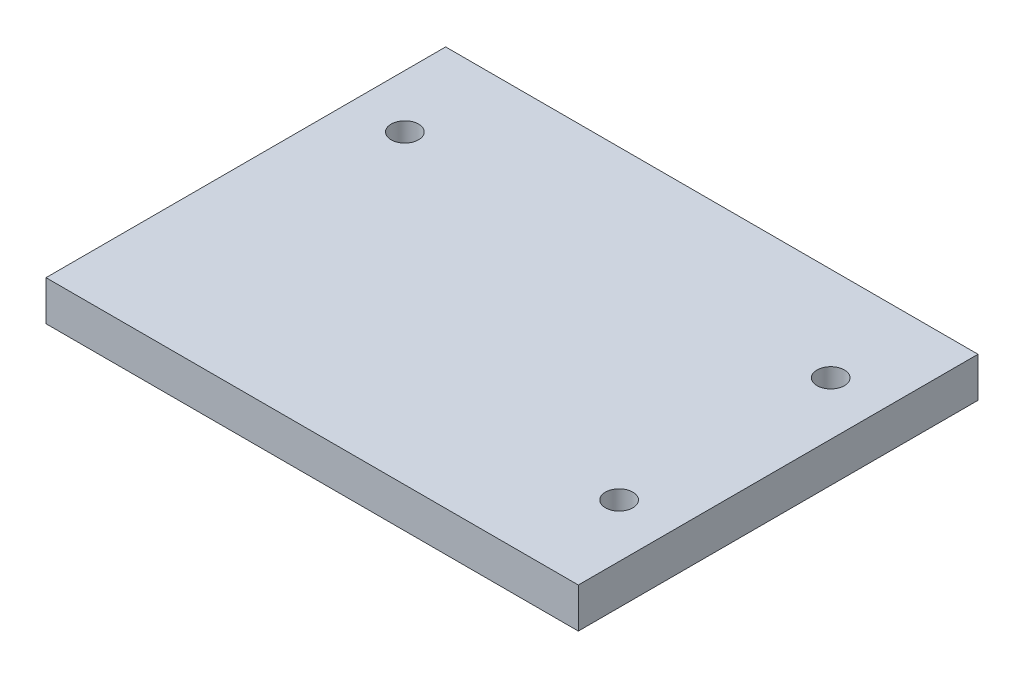
ISO-10303-21;
HEADER;
FILE_DESCRIPTION(('STEP AP214'),'2;1');
FILE_NAME('part.step','',(''),(''),'','','');
FILE_SCHEMA(('AUTOMOTIVE_DESIGN { 1 0 10303 214 1 1 1 1 }'));
ENDSEC;
DATA;
#1=APPLICATION_CONTEXT('core data for automotive mechanical design processes');
#2=APPLICATION_PROTOCOL_DEFINITION('international standard','automotive_design',2000,#1);
#3=PRODUCT_CONTEXT('',#1,'mechanical');
#4=PRODUCT('Part','Part','',(#3));
#5=PRODUCT_RELATED_PRODUCT_CATEGORY('part','',(#4));
#6=PRODUCT_DEFINITION_FORMATION('','',#4);
#7=PRODUCT_DEFINITION_CONTEXT('part definition',#1,'design');
#8=PRODUCT_DEFINITION('design','',#6,#7);
#9=PRODUCT_DEFINITION_SHAPE('','',#8);
#10=(LENGTH_UNIT() NAMED_UNIT(*) SI_UNIT(.MILLI.,.METRE.));
#11=(NAMED_UNIT(*) PLANE_ANGLE_UNIT() SI_UNIT($,.RADIAN.));
#12=(NAMED_UNIT(*) SI_UNIT($,.STERADIAN.) SOLID_ANGLE_UNIT());
#13=UNCERTAINTY_MEASURE_WITH_UNIT(LENGTH_MEASURE(1.E-05),#10,'distance_accuracy_value','');
#14=(GEOMETRIC_REPRESENTATION_CONTEXT(3) GLOBAL_UNCERTAINTY_ASSIGNED_CONTEXT((#13)) GLOBAL_UNIT_ASSIGNED_CONTEXT((#10,
#11,#12)) REPRESENTATION_CONTEXT('',''));
#15=CARTESIAN_POINT('',(0.,0.,0.));
#16=DIRECTION('',(0.,0.,1.));
#17=DIRECTION('',(1.,0.,0.));
#18=AXIS2_PLACEMENT_3D('',#15,#16,#17);
#19=CARTESIAN_POINT('',(0.,9.525,0.));
#20=DIRECTION('',(0.,1.,0.));
#21=DIRECTION('',(0.,0.,1.));
#22=AXIS2_PLACEMENT_3D('',#19,#20,#21);
#23=PLANE('',#22);
#24=CARTESIAN_POINT('',(50.8000037122111,9.525,-80.4872070292015));
#25=DIRECTION('',(0.,1.,0.));
#26=DIRECTION('',(0.,0.,1.));
#27=AXIS2_PLACEMENT_3D('',#24,#25,#26);
#28=CIRCLE('',#27,3.26390000000001);
#29=CARTESIAN_POINT('',(50.8000037122111,9.525,-83.7511070292015));
#30=VERTEX_POINT('',#29);
#31=EDGE_CURVE('E121',#30,#30,#28,.T.);
#32=ORIENTED_EDGE('',*,*,#31,.F.);
#33=EDGE_LOOP('',(#32));
#34=FACE_BOUND('',#33,.T.);
#35=DIRECTION('',(0.,0.,-1.));
#36=VECTOR('',#35,1.);
#37=CARTESIAN_POINT('',(63.5000015058791,9.525,-102.924639145253));
#38=LINE('',#37,#36);
#39=CARTESIAN_POINT('',(63.5000015058791,9.525,-7.57478379530386));
#40=VERTEX_POINT('',#39);
#41=CARTESIAN_POINT('',(63.5000015058791,9.525,-102.924639145253));
#42=VERTEX_POINT('',#41);
#43=EDGE_CURVE('E91',#40,#42,#38,.T.);
#44=ORIENTED_EDGE('',*,*,#43,.T.);
#45=DIRECTION('',(-1.,0.,0.));
#46=VECTOR('',#45,1.);
#47=CARTESIAN_POINT('',(-63.4999984941209,9.525,-102.924639145253));
#48=LINE('',#47,#46);
#49=CARTESIAN_POINT('',(-63.4999984941209,9.525,-102.924639145253));
#50=VERTEX_POINT('',#49);
#51=EDGE_CURVE('E86',#42,#50,#48,.T.);
#52=ORIENTED_EDGE('',*,*,#51,.T.);
#53=DIRECTION('',(0.,0.,1.));
#54=VECTOR('',#53,1.);
#55=CARTESIAN_POINT('',(-63.4999984941209,9.525,-102.924639145253));
#56=LINE('',#55,#54);
#57=CARTESIAN_POINT('',(-63.4999984941209,9.525,-7.57478379530388));
#58=VERTEX_POINT('',#57);
#59=EDGE_CURVE('E89',#50,#58,#56,.T.);
#60=ORIENTED_EDGE('',*,*,#59,.T.);
#61=DIRECTION('',(1.,0.,0.));
#62=VECTOR('',#61,1.);
#63=CARTESIAN_POINT('',(-63.4999984941209,9.525,-7.57478379530388));
#64=LINE('',#63,#62);
#65=EDGE_CURVE('E56',#58,#40,#64,.T.);
#66=ORIENTED_EDGE('',*,*,#65,.T.);
#67=EDGE_LOOP('',(#44,#52,#60,#66));
#68=FACE_BOUND('',#67,.T.);
#69=CARTESIAN_POINT('',(-50.8000007004529,9.525,-80.4872070292015));
#70=DIRECTION('',(0.,1.,0.));
#71=DIRECTION('',(0.,0.,1.));
#72=AXIS2_PLACEMENT_3D('',#69,#70,#71);
#73=CIRCLE('',#72,3.2639);
#74=CARTESIAN_POINT('',(-50.8000007004529,9.525,-83.7511070292015));
#75=VERTEX_POINT('',#74);
#76=EDGE_CURVE('E106',#75,#75,#73,.T.);
#77=ORIENTED_EDGE('',*,*,#76,.F.);
#78=EDGE_LOOP('',(#77));
#79=FACE_BOUND('',#78,.T.);
#80=CARTESIAN_POINT('',(50.8000037122111,9.525,-30.0122159113554));
#81=DIRECTION('',(0.,1.,0.));
#82=DIRECTION('',(0.,0.,1.));
#83=AXIS2_PLACEMENT_3D('',#80,#81,#82);
#84=CIRCLE('',#83,3.26390000000001);
#85=CARTESIAN_POINT('',(50.8000037122111,9.525,-33.2761159113554));
#86=VERTEX_POINT('',#85);
#87=EDGE_CURVE('E127',#86,#86,#84,.T.);
#88=ORIENTED_EDGE('',*,*,#87,.F.);
#89=EDGE_LOOP('',(#88));
#90=FACE_BOUND('',#89,.T.);
#91=ADVANCED_FACE('F39',(#34,#68,#79,#90),#23,.T.);
#92=CARTESIAN_POINT('',(0.,0.,0.));
#93=DIRECTION('',(0.,1.,0.));
#94=DIRECTION('',(0.,0.,1.));
#95=AXIS2_PLACEMENT_3D('',#92,#93,#94);
#96=PLANE('',#95);
#97=DIRECTION('',(0.,0.,-1.));
#98=VECTOR('',#97,1.);
#99=CARTESIAN_POINT('',(63.5000015058791,0.,-102.924639145253));
#100=LINE('',#99,#98);
#101=CARTESIAN_POINT('',(63.5000015058791,0.,-7.57478379530386));
#102=VERTEX_POINT('',#101);
#103=CARTESIAN_POINT('',(63.5000015058791,0.,-102.924639145253));
#104=VERTEX_POINT('',#103);
#105=EDGE_CURVE('E103',#102,#104,#100,.T.);
#106=ORIENTED_EDGE('',*,*,#105,.F.);
#107=DIRECTION('',(1.,0.,0.));
#108=VECTOR('',#107,1.);
#109=CARTESIAN_POINT('',(-63.4999984941209,0.,-7.57478379530388));
#110=LINE('',#109,#108);
#111=CARTESIAN_POINT('',(-63.4999984941209,0.,-7.57478379530388));
#112=VERTEX_POINT('',#111);
#113=EDGE_CURVE('E79',#112,#102,#110,.T.);
#114=ORIENTED_EDGE('',*,*,#113,.F.);
#115=DIRECTION('',(0.,0.,1.));
#116=VECTOR('',#115,1.);
#117=CARTESIAN_POINT('',(-63.4999984941209,0.,-102.924639145253));
#118=LINE('',#117,#116);
#119=CARTESIAN_POINT('',(-63.4999984941209,0.,-102.924639145253));
#120=VERTEX_POINT('',#119);
#121=EDGE_CURVE('E73',#120,#112,#118,.T.);
#122=ORIENTED_EDGE('',*,*,#121,.F.);
#123=DIRECTION('',(-1.,0.,0.));
#124=VECTOR('',#123,1.);
#125=CARTESIAN_POINT('',(-63.4999984941209,0.,-102.924639145253));
#126=LINE('',#125,#124);
#127=EDGE_CURVE('E95',#104,#120,#126,.T.);
#128=ORIENTED_EDGE('',*,*,#127,.F.);
#129=EDGE_LOOP('',(#106,#114,#122,#128));
#130=FACE_BOUND('',#129,.T.);
#131=CARTESIAN_POINT('',(-50.8000007004529,0.,-80.4872070292015));
#132=DIRECTION('',(0.,1.,0.));
#133=DIRECTION('',(0.,0.,1.));
#134=AXIS2_PLACEMENT_3D('',#131,#132,#133);
#135=CIRCLE('',#134,3.2639);
#136=CARTESIAN_POINT('',(-50.8000007004529,0.,-83.7511070292015));
#137=VERTEX_POINT('',#136);
#138=EDGE_CURVE('E118',#137,#137,#135,.T.);
#139=ORIENTED_EDGE('',*,*,#138,.T.);
#140=EDGE_LOOP('',(#139));
#141=FACE_BOUND('',#140,.T.);
#142=CARTESIAN_POINT('',(50.8000037122111,0.,-80.4872070292015));
#143=DIRECTION('',(0.,1.,0.));
#144=DIRECTION('',(0.,0.,1.));
#145=AXIS2_PLACEMENT_3D('',#142,#143,#144);
#146=CIRCLE('',#145,3.26390000000001);
#147=CARTESIAN_POINT('',(50.8000037122111,0.,-83.7511070292015));
#148=VERTEX_POINT('',#147);
#149=EDGE_CURVE('E124',#148,#148,#146,.T.);
#150=ORIENTED_EDGE('',*,*,#149,.T.);
#151=EDGE_LOOP('',(#150));
#152=FACE_BOUND('',#151,.T.);
#153=CARTESIAN_POINT('',(50.8000037122111,0.,-30.0122159113554));
#154=DIRECTION('',(0.,1.,0.));
#155=DIRECTION('',(0.,0.,1.));
#156=AXIS2_PLACEMENT_3D('',#153,#154,#155);
#157=CIRCLE('',#156,3.26390000000001);
#158=CARTESIAN_POINT('',(50.8000037122111,0.,-33.2761159113554));
#159=VERTEX_POINT('',#158);
#160=EDGE_CURVE('E130',#159,#159,#157,.T.);
#161=ORIENTED_EDGE('',*,*,#160,.T.);
#162=EDGE_LOOP('',(#161));
#163=FACE_BOUND('',#162,.T.);
#164=ADVANCED_FACE('F114',(#130,#141,#152,#163),#96,.F.);
#165=CARTESIAN_POINT('',(63.5000015058791,9.525,-102.924639145253));
#166=DIRECTION('',(-1.,0.,0.));
#167=DIRECTION('',(0.,0.,1.));
#168=AXIS2_PLACEMENT_3D('',#165,#166,#167);
#169=PLANE('',#168);
#170=ORIENTED_EDGE('',*,*,#105,.T.);
#171=DIRECTION('',(0.,-1.,0.));
#172=VECTOR('',#171,1.);
#173=CARTESIAN_POINT('',(63.5000015058791,9.525,-102.924639145253));
#174=LINE('',#173,#172);
#175=EDGE_CURVE('E11',#42,#104,#174,.T.);
#176=ORIENTED_EDGE('',*,*,#175,.F.);
#177=ORIENTED_EDGE('',*,*,#43,.F.);
#178=DIRECTION('',(0.,-1.,0.));
#179=VECTOR('',#178,1.);
#180=CARTESIAN_POINT('',(63.5000015058791,9.525,-7.57478379530386));
#181=LINE('',#180,#179);
#182=EDGE_CURVE('E99',#40,#102,#181,.T.);
#183=ORIENTED_EDGE('',*,*,#182,.T.);
#184=EDGE_LOOP('',(#170,#176,#177,#183));
#185=FACE_BOUND('',#184,.T.);
#186=ADVANCED_FACE('F41',(#185),#169,.F.);
#187=CARTESIAN_POINT('',(-63.4999984941209,9.525,-102.924639145253));
#188=DIRECTION('',(0.,0.,1.));
#189=DIRECTION('',(1.,0.,0.));
#190=AXIS2_PLACEMENT_3D('',#187,#188,#189);
#191=PLANE('',#190);
#192=ORIENTED_EDGE('',*,*,#127,.T.);
#193=DIRECTION('',(0.,-1.,0.));
#194=VECTOR('',#193,1.);
#195=CARTESIAN_POINT('',(-63.4999984941209,9.525,-102.924639145253));
#196=LINE('',#195,#194);
#197=EDGE_CURVE('E48',#50,#120,#196,.T.);
#198=ORIENTED_EDGE('',*,*,#197,.F.);
#199=ORIENTED_EDGE('',*,*,#51,.F.);
#200=ORIENTED_EDGE('',*,*,#175,.T.);
#201=EDGE_LOOP('',(#192,#198,#199,#200));
#202=FACE_BOUND('',#201,.T.);
#203=ADVANCED_FACE('F94',(#202),#191,.F.);
#204=CARTESIAN_POINT('',(-63.4999984941209,9.525,-102.924639145253));
#205=DIRECTION('',(1.,0.,0.));
#206=DIRECTION('',(0.,0.,-1.));
#207=AXIS2_PLACEMENT_3D('',#204,#205,#206);
#208=PLANE('',#207);
#209=ORIENTED_EDGE('',*,*,#121,.T.);
#210=DIRECTION('',(0.,-1.,0.));
#211=VECTOR('',#210,1.);
#212=CARTESIAN_POINT('',(-63.4999984941209,9.525,-7.57478379530388));
#213=LINE('',#212,#211);
#214=EDGE_CURVE('E96',#58,#112,#213,.T.);
#215=ORIENTED_EDGE('',*,*,#214,.F.);
#216=ORIENTED_EDGE('',*,*,#59,.F.);
#217=ORIENTED_EDGE('',*,*,#197,.T.);
#218=EDGE_LOOP('',(#209,#215,#216,#217));
#219=FACE_BOUND('',#218,.T.);
#220=ADVANCED_FACE('F97',(#219),#208,.F.);
#221=CARTESIAN_POINT('',(-63.4999984941209,9.525,-7.57478379530388));
#222=DIRECTION('',(0.,0.,-1.));
#223=DIRECTION('',(-1.,0.,0.));
#224=AXIS2_PLACEMENT_3D('',#221,#222,#223);
#225=PLANE('',#224);
#226=ORIENTED_EDGE('',*,*,#113,.T.);
#227=ORIENTED_EDGE('',*,*,#182,.F.);
#228=ORIENTED_EDGE('',*,*,#65,.F.);
#229=ORIENTED_EDGE('',*,*,#214,.T.);
#230=EDGE_LOOP('',(#226,#227,#228,#229));
#231=FACE_BOUND('',#230,.T.);
#232=ADVANCED_FACE('F111',(#231),#225,.F.);
#233=CARTESIAN_POINT('',(-50.8000007004529,9.525,-80.4872070292015));
#234=DIRECTION('',(0.,-1.,0.));
#235=DIRECTION('',(0.,0.,-1.));
#236=AXIS2_PLACEMENT_3D('',#233,#234,#235);
#237=CYLINDRICAL_SURFACE('',#236,3.2639);
#238=CARTESIAN_POINT('',(-50.8000007004529,9.525,-83.7511070292015));
#239=CARTESIAN_POINT('',(-50.8000007004529,9.42578125,-83.7511070292015));
#240=CARTESIAN_POINT('',(-50.8000007004529,9.3265625,-83.7511070292015));
#241=CARTESIAN_POINT('',(-50.8000007004529,9.128125,-83.7511070292015));
#242=CARTESIAN_POINT('',(-50.8000007004529,9.02890625,-83.7511070292015));
#243=CARTESIAN_POINT('',(-50.8000007004529,8.83046875,-83.7511070292015));
#244=CARTESIAN_POINT('',(-50.8000007004529,8.73125,-83.7511070292015));
#245=CARTESIAN_POINT('',(-50.8000007004529,8.5328125,-83.7511070292015));
#246=CARTESIAN_POINT('',(-50.8000007004529,8.43359375,-83.7511070292015));
#247=CARTESIAN_POINT('',(-50.8000007004529,8.23515625,-83.7511070292015));
#248=CARTESIAN_POINT('',(-50.8000007004529,8.1359375,-83.7511070292015));
#249=CARTESIAN_POINT('',(-50.8000007004529,7.9375,-83.7511070292015));
#250=CARTESIAN_POINT('',(-50.8000007004529,7.83828125,-83.7511070292015));
#251=CARTESIAN_POINT('',(-50.8000007004529,7.63984375,-83.7511070292015));
#252=CARTESIAN_POINT('',(-50.8000007004529,7.540625,-83.7511070292015));
#253=CARTESIAN_POINT('',(-50.8000007004529,7.3421875,-83.7511070292015));
#254=CARTESIAN_POINT('',(-50.8000007004529,7.24296875,-83.7511070292015));
#255=CARTESIAN_POINT('',(-50.8000007004529,7.04453125,-83.7511070292015));
#256=CARTESIAN_POINT('',(-50.8000007004529,6.9453125,-83.7511070292015));
#257=CARTESIAN_POINT('',(-50.8000007004529,6.746875,-83.7511070292015));
#258=CARTESIAN_POINT('',(-50.8000007004529,6.64765625,-83.7511070292015));
#259=CARTESIAN_POINT('',(-50.8000007004529,6.44921875,-83.7511070292015));
#260=CARTESIAN_POINT('',(-50.8000007004529,6.35,-83.7511070292015));
#261=CARTESIAN_POINT('',(-50.8000007004529,6.1515625,-83.7511070292015));
#262=CARTESIAN_POINT('',(-50.8000007004529,6.05234375,-83.7511070292015));
#263=CARTESIAN_POINT('',(-50.8000007004529,5.85390625,-83.7511070292015));
#264=CARTESIAN_POINT('',(-50.8000007004529,5.7546875,-83.7511070292015));
#265=CARTESIAN_POINT('',(-50.8000007004529,5.55625,-83.7511070292015));
#266=CARTESIAN_POINT('',(-50.8000007004529,5.45703125,-83.7511070292015));
#267=CARTESIAN_POINT('',(-50.8000007004529,5.25859375,-83.7511070292015));
#268=CARTESIAN_POINT('',(-50.8000007004529,5.159375,-83.7511070292015));
#269=CARTESIAN_POINT('',(-50.8000007004529,4.9609375,-83.7511070292015));
#270=CARTESIAN_POINT('',(-50.8000007004529,4.86171875,-83.7511070292015));
#271=CARTESIAN_POINT('',(-50.8000007004529,4.66328125,-83.7511070292015));
#272=CARTESIAN_POINT('',(-50.8000007004529,4.5640625,-83.7511070292015));
#273=CARTESIAN_POINT('',(-50.8000007004529,4.365625,-83.7511070292015));
#274=CARTESIAN_POINT('',(-50.8000007004529,4.26640625,-83.7511070292015));
#275=CARTESIAN_POINT('',(-50.8000007004529,4.06796875,-83.7511070292015));
#276=CARTESIAN_POINT('',(-50.8000007004529,3.96875,-83.7511070292015));
#277=CARTESIAN_POINT('',(-50.8000007004529,3.7703125,-83.7511070292015));
#278=CARTESIAN_POINT('',(-50.8000007004529,3.67109375,-83.7511070292015));
#279=CARTESIAN_POINT('',(-50.8000007004529,3.47265625,-83.7511070292015));
#280=CARTESIAN_POINT('',(-50.8000007004529,3.3734375,-83.7511070292015));
#281=CARTESIAN_POINT('',(-50.8000007004529,3.175,-83.7511070292015));
#282=CARTESIAN_POINT('',(-50.8000007004529,3.07578125,-83.7511070292015));
#283=CARTESIAN_POINT('',(-50.8000007004529,2.87734375,-83.7511070292015));
#284=CARTESIAN_POINT('',(-50.8000007004529,2.778125,-83.7511070292015));
#285=CARTESIAN_POINT('',(-50.8000007004529,2.5796875,-83.7511070292015));
#286=CARTESIAN_POINT('',(-50.8000007004529,2.48046875,-83.7511070292015));
#287=CARTESIAN_POINT('',(-50.8000007004529,2.28203125,-83.7511070292015));
#288=CARTESIAN_POINT('',(-50.8000007004529,2.1828125,-83.7511070292015));
#289=CARTESIAN_POINT('',(-50.8000007004529,1.984375,-83.7511070292015));
#290=CARTESIAN_POINT('',(-50.8000007004529,1.88515625,-83.7511070292015));
#291=CARTESIAN_POINT('',(-50.8000007004529,1.68671875,-83.7511070292015));
#292=CARTESIAN_POINT('',(-50.8000007004529,1.5875,-83.7511070292015));
#293=CARTESIAN_POINT('',(-50.8000007004529,1.3890625,-83.7511070292015));
#294=CARTESIAN_POINT('',(-50.8000007004529,1.28984375,-83.7511070292015));
#295=CARTESIAN_POINT('',(-50.8000007004529,1.09140625,-83.7511070292015));
#296=CARTESIAN_POINT('',(-50.8000007004529,0.992187500000001,-83.7511070292015));
#297=CARTESIAN_POINT('',(-50.8000007004529,0.793750000000001,-83.7511070292015));
#298=CARTESIAN_POINT('',(-50.8000007004529,0.69453125,-83.7511070292015));
#299=CARTESIAN_POINT('',(-50.8000007004529,0.49609375,-83.7511070292015));
#300=CARTESIAN_POINT('',(-50.8000007004529,0.396875,-83.7511070292015));
#301=CARTESIAN_POINT('',(-50.8000007004529,0.1984375,-83.7511070292015));
#302=CARTESIAN_POINT('',(-50.8000007004529,0.0992187500000001,-83.7511070292015));
#303=CARTESIAN_POINT('',(-50.8000007004529,0.,-83.7511070292015));
#304=B_SPLINE_CURVE_WITH_KNOTS('',3,(#238,#239,#240,#241,#242,#243,#244,#245,#246,#247,#248,
#249,#250,#251,#252,#253,#254,#255,#256,#257,#258,#259,#260,#261,#262,#263,#264,#265,#266,#267,
#268,#269,#270,#271,#272,#273,#274,#275,#276,#277,#278,#279,#280,#281,#282,#283,#284,#285,#286,
#287,#288,#289,#290,#291,#292,#293,#294,#295,#296,#297,#298,#299,#300,#301,#302,#303),
.UNSPECIFIED.,.F.,.F.,(4,2,2,2,2,2,2,2,2,2,2,2,2,2,2,2,2,2,2,2,2,2,2,2,2,2,2,2,2,2,2,2,4),(0.,
0.29765625,0.5953125,0.892968750000001,1.190625,1.48828125,1.7859375,2.08359375,2.38125,
2.67890625,2.9765625,3.27421875,3.571875,3.86953125,4.1671875,4.46484375,4.7625,5.06015625,
5.3578125,5.65546875,5.953125,6.25078125,6.5484375,6.84609375,7.14375,7.44140625,7.7390625,
8.03671875,8.334375,8.63203125,8.9296875,9.22734375,9.525),.UNSPECIFIED.);
#305=EDGE_CURVE('BSEAM148',#75,#137,#304,.T.);
#306=ORIENTED_EDGE('',*,*,#76,.T.);
#307=ORIENTED_EDGE('',*,*,#138,.F.);
#308=ORIENTED_EDGE('',*,*,#305,.T.);
#309=ORIENTED_EDGE('',*,*,#305,.F.);
#310=EDGE_LOOP('',(#306,#308,#307,#309));
#311=FACE_BOUND('',#310,.T.);
#312=ADVANCED_FACE('F148',(#311),#237,.F.);
#313=CARTESIAN_POINT('',(50.8000037122111,9.525,-80.4872070292015));
#314=DIRECTION('',(0.,-1.,0.));
#315=DIRECTION('',(0.,0.,-1.));
#316=AXIS2_PLACEMENT_3D('',#313,#314,#315);
#317=CYLINDRICAL_SURFACE('',#316,3.26390000000001);
#318=CARTESIAN_POINT('',(50.8000037122111,9.525,-83.7511070292015));
#319=CARTESIAN_POINT('',(50.8000037122111,9.42578125,-83.7511070292015));
#320=CARTESIAN_POINT('',(50.8000037122111,9.3265625,-83.7511070292015));
#321=CARTESIAN_POINT('',(50.8000037122111,9.128125,-83.7511070292015));
#322=CARTESIAN_POINT('',(50.8000037122111,9.02890625,-83.7511070292015));
#323=CARTESIAN_POINT('',(50.8000037122111,8.83046875,-83.7511070292015));
#324=CARTESIAN_POINT('',(50.8000037122111,8.73125,-83.7511070292015));
#325=CARTESIAN_POINT('',(50.8000037122111,8.5328125,-83.7511070292015));
#326=CARTESIAN_POINT('',(50.8000037122111,8.43359375,-83.7511070292015));
#327=CARTESIAN_POINT('',(50.8000037122111,8.23515625,-83.7511070292015));
#328=CARTESIAN_POINT('',(50.8000037122111,8.1359375,-83.7511070292015));
#329=CARTESIAN_POINT('',(50.8000037122111,7.9375,-83.7511070292015));
#330=CARTESIAN_POINT('',(50.8000037122111,7.83828125,-83.7511070292015));
#331=CARTESIAN_POINT('',(50.8000037122111,7.63984375,-83.7511070292015));
#332=CARTESIAN_POINT('',(50.8000037122111,7.540625,-83.7511070292015));
#333=CARTESIAN_POINT('',(50.8000037122111,7.3421875,-83.7511070292015));
#334=CARTESIAN_POINT('',(50.8000037122111,7.24296875,-83.7511070292015));
#335=CARTESIAN_POINT('',(50.8000037122111,7.04453125,-83.7511070292015));
#336=CARTESIAN_POINT('',(50.8000037122111,6.9453125,-83.7511070292015));
#337=CARTESIAN_POINT('',(50.8000037122111,6.746875,-83.7511070292015));
#338=CARTESIAN_POINT('',(50.8000037122111,6.64765625,-83.7511070292015));
#339=CARTESIAN_POINT('',(50.8000037122111,6.44921875,-83.7511070292015));
#340=CARTESIAN_POINT('',(50.8000037122111,6.35,-83.7511070292015));
#341=CARTESIAN_POINT('',(50.8000037122111,6.1515625,-83.7511070292015));
#342=CARTESIAN_POINT('',(50.8000037122111,6.05234375,-83.7511070292015));
#343=CARTESIAN_POINT('',(50.8000037122111,5.85390625,-83.7511070292015));
#344=CARTESIAN_POINT('',(50.8000037122111,5.7546875,-83.7511070292015));
#345=CARTESIAN_POINT('',(50.8000037122111,5.55625,-83.7511070292015));
#346=CARTESIAN_POINT('',(50.8000037122111,5.45703125,-83.7511070292015));
#347=CARTESIAN_POINT('',(50.8000037122111,5.25859375,-83.7511070292015));
#348=CARTESIAN_POINT('',(50.8000037122111,5.159375,-83.7511070292015));
#349=CARTESIAN_POINT('',(50.8000037122111,4.9609375,-83.7511070292015));
#350=CARTESIAN_POINT('',(50.8000037122111,4.86171875,-83.7511070292015));
#351=CARTESIAN_POINT('',(50.8000037122111,4.66328125,-83.7511070292015));
#352=CARTESIAN_POINT('',(50.8000037122111,4.5640625,-83.7511070292015));
#353=CARTESIAN_POINT('',(50.8000037122111,4.365625,-83.7511070292015));
#354=CARTESIAN_POINT('',(50.8000037122111,4.26640625,-83.7511070292015));
#355=CARTESIAN_POINT('',(50.8000037122111,4.06796875,-83.7511070292015));
#356=CARTESIAN_POINT('',(50.8000037122111,3.96875,-83.7511070292015));
#357=CARTESIAN_POINT('',(50.8000037122111,3.7703125,-83.7511070292015));
#358=CARTESIAN_POINT('',(50.8000037122111,3.67109375,-83.7511070292015));
#359=CARTESIAN_POINT('',(50.8000037122111,3.47265625,-83.7511070292015));
#360=CARTESIAN_POINT('',(50.8000037122111,3.3734375,-83.7511070292015));
#361=CARTESIAN_POINT('',(50.8000037122111,3.175,-83.7511070292015));
#362=CARTESIAN_POINT('',(50.8000037122111,3.07578125,-83.7511070292015));
#363=CARTESIAN_POINT('',(50.8000037122111,2.87734375,-83.7511070292015));
#364=CARTESIAN_POINT('',(50.8000037122111,2.778125,-83.7511070292015));
#365=CARTESIAN_POINT('',(50.8000037122111,2.5796875,-83.7511070292015));
#366=CARTESIAN_POINT('',(50.8000037122111,2.48046875,-83.7511070292015));
#367=CARTESIAN_POINT('',(50.8000037122111,2.28203125,-83.7511070292015));
#368=CARTESIAN_POINT('',(50.8000037122111,2.1828125,-83.7511070292015));
#369=CARTESIAN_POINT('',(50.8000037122111,1.984375,-83.7511070292015));
#370=CARTESIAN_POINT('',(50.8000037122111,1.88515625,-83.7511070292015));
#371=CARTESIAN_POINT('',(50.8000037122111,1.68671875,-83.7511070292015));
#372=CARTESIAN_POINT('',(50.8000037122111,1.5875,-83.7511070292015));
#373=CARTESIAN_POINT('',(50.8000037122111,1.3890625,-83.7511070292015));
#374=CARTESIAN_POINT('',(50.8000037122111,1.28984375,-83.7511070292015));
#375=CARTESIAN_POINT('',(50.8000037122111,1.09140625,-83.7511070292015));
#376=CARTESIAN_POINT('',(50.8000037122111,0.992187500000001,-83.7511070292015));
#377=CARTESIAN_POINT('',(50.8000037122111,0.793750000000001,-83.7511070292015));
#378=CARTESIAN_POINT('',(50.8000037122111,0.69453125,-83.7511070292015));
#379=CARTESIAN_POINT('',(50.8000037122111,0.49609375,-83.7511070292015));
#380=CARTESIAN_POINT('',(50.8000037122111,0.396875,-83.7511070292015));
#381=CARTESIAN_POINT('',(50.8000037122111,0.1984375,-83.7511070292015));
#382=CARTESIAN_POINT('',(50.8000037122111,0.0992187500000001,-83.7511070292015));
#383=CARTESIAN_POINT('',(50.8000037122111,0.,-83.7511070292015));
#384=B_SPLINE_CURVE_WITH_KNOTS('',3,(#318,#319,#320,#321,#322,#323,#324,#325,#326,#327,#328,
#329,#330,#331,#332,#333,#334,#335,#336,#337,#338,#339,#340,#341,#342,#343,#344,#345,#346,#347,
#348,#349,#350,#351,#352,#353,#354,#355,#356,#357,#358,#359,#360,#361,#362,#363,#364,#365,#366,
#367,#368,#369,#370,#371,#372,#373,#374,#375,#376,#377,#378,#379,#380,#381,#382,#383),
.UNSPECIFIED.,.F.,.F.,(4,2,2,2,2,2,2,2,2,2,2,2,2,2,2,2,2,2,2,2,2,2,2,2,2,2,2,2,2,2,2,2,4),(0.,
0.29765625,0.5953125,0.892968750000001,1.190625,1.48828125,1.7859375,2.08359375,2.38125,
2.67890625,2.9765625,3.27421875,3.571875,3.86953125,4.1671875,4.46484375,4.7625,5.06015625,
5.3578125,5.65546875,5.953125,6.25078125,6.5484375,6.84609375,7.14375,7.44140625,7.7390625,
8.03671875,8.334375,8.63203125,8.9296875,9.22734375,9.525),.UNSPECIFIED.);
#385=EDGE_CURVE('BSEAM193',#30,#148,#384,.T.);
#386=ORIENTED_EDGE('',*,*,#31,.T.);
#387=ORIENTED_EDGE('',*,*,#149,.F.);
#388=ORIENTED_EDGE('',*,*,#385,.T.);
#389=ORIENTED_EDGE('',*,*,#385,.F.);
#390=EDGE_LOOP('',(#386,#388,#387,#389));
#391=FACE_BOUND('',#390,.T.);
#392=ADVANCED_FACE('F193',(#391),#317,.F.);
#393=CARTESIAN_POINT('',(50.8000037122111,9.525,-30.0122159113554));
#394=DIRECTION('',(0.,-1.,0.));
#395=DIRECTION('',(0.,0.,-1.));
#396=AXIS2_PLACEMENT_3D('',#393,#394,#395);
#397=CYLINDRICAL_SURFACE('',#396,3.26390000000001);
#398=CARTESIAN_POINT('',(50.8000037122111,9.525,-33.2761159113554));
#399=CARTESIAN_POINT('',(50.8000037122111,9.42578125,-33.2761159113554));
#400=CARTESIAN_POINT('',(50.8000037122111,9.3265625,-33.2761159113554));
#401=CARTESIAN_POINT('',(50.8000037122111,9.128125,-33.2761159113554));
#402=CARTESIAN_POINT('',(50.8000037122111,9.02890625,-33.2761159113554));
#403=CARTESIAN_POINT('',(50.8000037122111,8.83046875,-33.2761159113554));
#404=CARTESIAN_POINT('',(50.8000037122111,8.73125,-33.2761159113554));
#405=CARTESIAN_POINT('',(50.8000037122111,8.5328125,-33.2761159113554));
#406=CARTESIAN_POINT('',(50.8000037122111,8.43359375,-33.2761159113554));
#407=CARTESIAN_POINT('',(50.8000037122111,8.23515625,-33.2761159113554));
#408=CARTESIAN_POINT('',(50.8000037122111,8.1359375,-33.2761159113554));
#409=CARTESIAN_POINT('',(50.8000037122111,7.9375,-33.2761159113554));
#410=CARTESIAN_POINT('',(50.8000037122111,7.83828125,-33.2761159113554));
#411=CARTESIAN_POINT('',(50.8000037122111,7.63984375,-33.2761159113554));
#412=CARTESIAN_POINT('',(50.8000037122111,7.540625,-33.2761159113554));
#413=CARTESIAN_POINT('',(50.8000037122111,7.3421875,-33.2761159113554));
#414=CARTESIAN_POINT('',(50.8000037122111,7.24296875,-33.2761159113554));
#415=CARTESIAN_POINT('',(50.8000037122111,7.04453125,-33.2761159113554));
#416=CARTESIAN_POINT('',(50.8000037122111,6.9453125,-33.2761159113554));
#417=CARTESIAN_POINT('',(50.8000037122111,6.746875,-33.2761159113554));
#418=CARTESIAN_POINT('',(50.8000037122111,6.64765625,-33.2761159113554));
#419=CARTESIAN_POINT('',(50.8000037122111,6.44921875,-33.2761159113554));
#420=CARTESIAN_POINT('',(50.8000037122111,6.35,-33.2761159113554));
#421=CARTESIAN_POINT('',(50.8000037122111,6.1515625,-33.2761159113554));
#422=CARTESIAN_POINT('',(50.8000037122111,6.05234375,-33.2761159113554));
#423=CARTESIAN_POINT('',(50.8000037122111,5.85390625,-33.2761159113554));
#424=CARTESIAN_POINT('',(50.8000037122111,5.7546875,-33.2761159113554));
#425=CARTESIAN_POINT('',(50.8000037122111,5.55625,-33.2761159113554));
#426=CARTESIAN_POINT('',(50.8000037122111,5.45703125,-33.2761159113554));
#427=CARTESIAN_POINT('',(50.8000037122111,5.25859375,-33.2761159113554));
#428=CARTESIAN_POINT('',(50.8000037122111,5.159375,-33.2761159113554));
#429=CARTESIAN_POINT('',(50.8000037122111,4.9609375,-33.2761159113554));
#430=CARTESIAN_POINT('',(50.8000037122111,4.86171875,-33.2761159113554));
#431=CARTESIAN_POINT('',(50.8000037122111,4.66328125,-33.2761159113554));
#432=CARTESIAN_POINT('',(50.8000037122111,4.5640625,-33.2761159113554));
#433=CARTESIAN_POINT('',(50.8000037122111,4.365625,-33.2761159113554));
#434=CARTESIAN_POINT('',(50.8000037122111,4.26640625,-33.2761159113554));
#435=CARTESIAN_POINT('',(50.8000037122111,4.06796875,-33.2761159113554));
#436=CARTESIAN_POINT('',(50.8000037122111,3.96875,-33.2761159113554));
#437=CARTESIAN_POINT('',(50.8000037122111,3.7703125,-33.2761159113554));
#438=CARTESIAN_POINT('',(50.8000037122111,3.67109375,-33.2761159113554));
#439=CARTESIAN_POINT('',(50.8000037122111,3.47265625,-33.2761159113554));
#440=CARTESIAN_POINT('',(50.8000037122111,3.3734375,-33.2761159113554));
#441=CARTESIAN_POINT('',(50.8000037122111,3.175,-33.2761159113554));
#442=CARTESIAN_POINT('',(50.8000037122111,3.07578125,-33.2761159113554));
#443=CARTESIAN_POINT('',(50.8000037122111,2.87734375,-33.2761159113554));
#444=CARTESIAN_POINT('',(50.8000037122111,2.778125,-33.2761159113554));
#445=CARTESIAN_POINT('',(50.8000037122111,2.5796875,-33.2761159113554));
#446=CARTESIAN_POINT('',(50.8000037122111,2.48046875,-33.2761159113554));
#447=CARTESIAN_POINT('',(50.8000037122111,2.28203125,-33.2761159113554));
#448=CARTESIAN_POINT('',(50.8000037122111,2.1828125,-33.2761159113554));
#449=CARTESIAN_POINT('',(50.8000037122111,1.984375,-33.2761159113554));
#450=CARTESIAN_POINT('',(50.8000037122111,1.88515625,-33.2761159113554));
#451=CARTESIAN_POINT('',(50.8000037122111,1.68671875,-33.2761159113554));
#452=CARTESIAN_POINT('',(50.8000037122111,1.5875,-33.2761159113554));
#453=CARTESIAN_POINT('',(50.8000037122111,1.3890625,-33.2761159113554));
#454=CARTESIAN_POINT('',(50.8000037122111,1.28984375,-33.2761159113554));
#455=CARTESIAN_POINT('',(50.8000037122111,1.09140625,-33.2761159113554));
#456=CARTESIAN_POINT('',(50.8000037122111,0.992187500000001,-33.2761159113554));
#457=CARTESIAN_POINT('',(50.8000037122111,0.793750000000001,-33.2761159113554));
#458=CARTESIAN_POINT('',(50.8000037122111,0.69453125,-33.2761159113554));
#459=CARTESIAN_POINT('',(50.8000037122111,0.49609375,-33.2761159113554));
#460=CARTESIAN_POINT('',(50.8000037122111,0.396875,-33.2761159113554));
#461=CARTESIAN_POINT('',(50.8000037122111,0.1984375,-33.2761159113554));
#462=CARTESIAN_POINT('',(50.8000037122111,0.0992187500000001,-33.2761159113554));
#463=CARTESIAN_POINT('',(50.8000037122111,0.,-33.2761159113554));
#464=B_SPLINE_CURVE_WITH_KNOTS('',3,(#398,#399,#400,#401,#402,#403,#404,#405,#406,#407,#408,
#409,#410,#411,#412,#413,#414,#415,#416,#417,#418,#419,#420,#421,#422,#423,#424,#425,#426,#427,
#428,#429,#430,#431,#432,#433,#434,#435,#436,#437,#438,#439,#440,#441,#442,#443,#444,#445,#446,
#447,#448,#449,#450,#451,#452,#453,#454,#455,#456,#457,#458,#459,#460,#461,#462,#463),
.UNSPECIFIED.,.F.,.F.,(4,2,2,2,2,2,2,2,2,2,2,2,2,2,2,2,2,2,2,2,2,2,2,2,2,2,2,2,2,2,2,2,4),(0.,
0.29765625,0.5953125,0.892968750000001,1.190625,1.48828125,1.7859375,2.08359375,2.38125,
2.67890625,2.9765625,3.27421875,3.571875,3.86953125,4.1671875,4.46484375,4.7625,5.06015625,
5.3578125,5.65546875,5.953125,6.25078125,6.5484375,6.84609375,7.14375,7.44140625,7.7390625,
8.03671875,8.334375,8.63203125,8.9296875,9.22734375,9.525),.UNSPECIFIED.);
#465=EDGE_CURVE('BSEAM136',#86,#159,#464,.T.);
#466=ORIENTED_EDGE('',*,*,#87,.T.);
#467=ORIENTED_EDGE('',*,*,#160,.F.);
#468=ORIENTED_EDGE('',*,*,#465,.T.);
#469=ORIENTED_EDGE('',*,*,#465,.F.);
#470=EDGE_LOOP('',(#466,#468,#467,#469));
#471=FACE_BOUND('',#470,.T.);
#472=ADVANCED_FACE('F136',(#471),#397,.F.);
#473=CLOSED_SHELL('',(#91,#164,#186,#203,#220,#232,#312,#392,#472));
#474=MANIFOLD_SOLID_BREP('B2',#473);
#475=ADVANCED_BREP_SHAPE_REPRESENTATION('',(#18,#474),#14);
#476=SHAPE_DEFINITION_REPRESENTATION(#9,#475);
ENDSEC;
END-ISO-10303-21;
